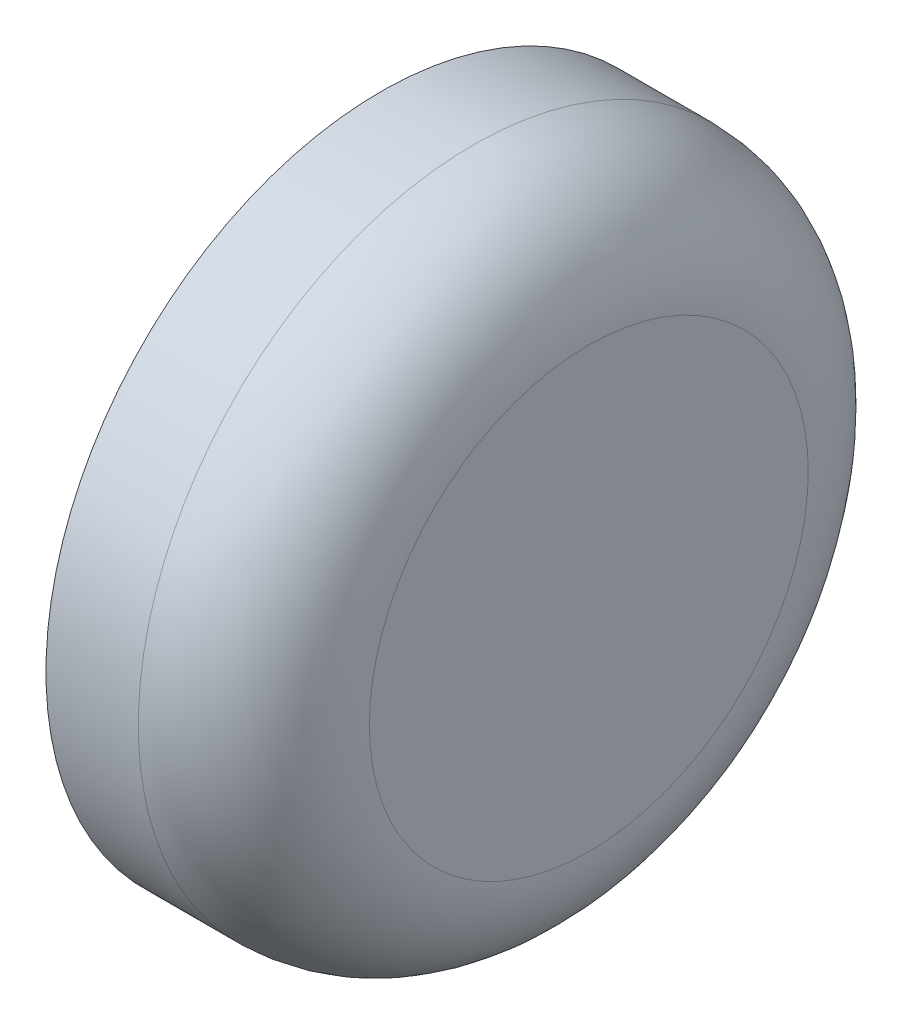
ISO-10303-21;
HEADER;
FILE_DESCRIPTION(('STEP AP214'),'2;1');
FILE_NAME('part.step','',(''),(''),'','','');
FILE_SCHEMA(('AUTOMOTIVE_DESIGN { 1 0 10303 214 1 1 1 1 }'));
ENDSEC;
DATA;
#1=APPLICATION_CONTEXT('core data for automotive mechanical design processes');
#2=APPLICATION_PROTOCOL_DEFINITION('international standard','automotive_design',2000,#1);
#3=PRODUCT_CONTEXT('',#1,'mechanical');
#4=PRODUCT('Part','Part','',(#3));
#5=PRODUCT_RELATED_PRODUCT_CATEGORY('part','',(#4));
#6=PRODUCT_DEFINITION_FORMATION('','',#4);
#7=PRODUCT_DEFINITION_CONTEXT('part definition',#1,'design');
#8=PRODUCT_DEFINITION('design','',#6,#7);
#9=PRODUCT_DEFINITION_SHAPE('','',#8);
#10=(LENGTH_UNIT() NAMED_UNIT(*) SI_UNIT(.MILLI.,.METRE.));
#11=(NAMED_UNIT(*) PLANE_ANGLE_UNIT() SI_UNIT($,.RADIAN.));
#12=(NAMED_UNIT(*) SI_UNIT($,.STERADIAN.) SOLID_ANGLE_UNIT());
#13=UNCERTAINTY_MEASURE_WITH_UNIT(LENGTH_MEASURE(1.E-05),#10,'distance_accuracy_value','');
#14=(GEOMETRIC_REPRESENTATION_CONTEXT(3) GLOBAL_UNCERTAINTY_ASSIGNED_CONTEXT((#13)) GLOBAL_UNIT_ASSIGNED_CONTEXT((#10,
#11,#12)) REPRESENTATION_CONTEXT('',''));
#15=CARTESIAN_POINT('',(0.,0.,0.));
#16=DIRECTION('',(0.,0.,1.));
#17=DIRECTION('',(1.,0.,0.));
#18=AXIS2_PLACEMENT_3D('',#15,#16,#17);
#19=CARTESIAN_POINT('',(4.5,0.,0.));
#20=DIRECTION('',(-1.,0.,0.));
#21=DIRECTION('',(0.,0.,1.));
#22=AXIS2_PLACEMENT_3D('',#19,#20,#21);
#23=CYLINDRICAL_SURFACE('',#22,7.25);
#24=CARTESIAN_POINT('',(2.,0.,0.));
#25=DIRECTION('',(1.,0.,0.));
#26=DIRECTION('',(0.,0.,-1.));
#27=AXIS2_PLACEMENT_3D('',#24,#25,#26);
#28=CIRCLE('',#27,7.25);
#29=CARTESIAN_POINT('',(2.,0.,-7.25));
#30=VERTEX_POINT('',#29);
#31=EDGE_CURVE('E10',#30,#30,#28,.F.);
#32=ORIENTED_EDGE('',*,*,#31,.T.);
#33=EDGE_LOOP('',(#32));
#34=FACE_BOUND('',#33,.T.);
#35=CARTESIAN_POINT('',(0.,0.,0.));
#36=DIRECTION('',(1.,0.,0.));
#37=DIRECTION('',(0.,0.,-1.));
#38=AXIS2_PLACEMENT_3D('',#35,#36,#37);
#39=CIRCLE('',#38,7.25);
#40=CARTESIAN_POINT('',(0.,0.,-7.25));
#41=VERTEX_POINT('',#40);
#42=EDGE_CURVE('E50',#41,#41,#39,.T.);
#43=ORIENTED_EDGE('',*,*,#42,.T.);
#44=EDGE_LOOP('',(#43));
#45=FACE_BOUND('',#44,.T.);
#46=ADVANCED_FACE('F37',(#34,#45),#23,.T.);
#47=CARTESIAN_POINT('',(4.5,0.,0.));
#48=DIRECTION('',(1.,0.,0.));
#49=DIRECTION('',(0.,0.,-1.));
#50=AXIS2_PLACEMENT_3D('',#47,#48,#49);
#51=PLANE('',#50);
#52=CARTESIAN_POINT('',(4.5,0.,0.));
#53=DIRECTION('',(1.,0.,0.));
#54=DIRECTION('',(0.,0.,-1.));
#55=AXIS2_PLACEMENT_3D('',#52,#53,#54);
#56=CIRCLE('',#55,4.75);
#57=CARTESIAN_POINT('',(4.5,0.,-4.75));
#58=VERTEX_POINT('',#57);
#59=EDGE_CURVE('E45',#58,#58,#56,.T.);
#60=ORIENTED_EDGE('',*,*,#59,.T.);
#61=EDGE_LOOP('',(#60));
#62=FACE_BOUND('',#61,.T.);
#63=ADVANCED_FACE('F77',(#62),#51,.T.);
#64=CARTESIAN_POINT('',(0.,0.,0.));
#65=DIRECTION('',(1.,0.,0.));
#66=DIRECTION('',(0.,0.,-1.));
#67=AXIS2_PLACEMENT_3D('',#64,#65,#66);
#68=PLANE('',#67);
#69=CARTESIAN_POINT('',(0.,0.,0.));
#70=DIRECTION('',(-1.,0.,0.));
#71=DIRECTION('',(0.,0.,1.));
#72=AXIS2_PLACEMENT_3D('',#69,#70,#71);
#73=CIRCLE('',#72,3.3);
#74=CARTESIAN_POINT('',(0.,0.,3.3));
#75=VERTEX_POINT('',#74);
#76=EDGE_CURVE('E58',#75,#75,#73,.T.);
#77=ORIENTED_EDGE('',*,*,#76,.F.);
#78=EDGE_LOOP('',(#77));
#79=FACE_BOUND('',#78,.T.);
#80=ORIENTED_EDGE('',*,*,#42,.F.);
#81=EDGE_LOOP('',(#80));
#82=FACE_BOUND('',#81,.T.);
#83=ADVANCED_FACE('F74',(#79,#82),#68,.F.);
#84=CARTESIAN_POINT('',(2.,0.,0.));
#85=DIRECTION('',(1.,0.,0.));
#86=DIRECTION('',(0.,0.,-1.));
#87=AXIS2_PLACEMENT_3D('',#84,#85,#86);
#88=TOROIDAL_SURFACE('',#87,4.75,2.5);
#89=ORIENTED_EDGE('',*,*,#31,.F.);
#90=EDGE_LOOP('',(#89));
#91=FACE_BOUND('',#90,.T.);
#92=ORIENTED_EDGE('',*,*,#59,.F.);
#93=EDGE_LOOP('',(#92));
#94=FACE_BOUND('',#93,.T.);
#95=ADVANCED_FACE('F39',(#91,#94),#88,.T.);
#96=CARTESIAN_POINT('',(1.,0.,0.));
#97=DIRECTION('',(-1.,0.,0.));
#98=DIRECTION('',(0.,0.,1.));
#99=AXIS2_PLACEMENT_3D('',#96,#97,#98);
#100=CYLINDRICAL_SURFACE('',#99,3.3);
#101=CARTESIAN_POINT('',(1.,0.,0.));
#102=DIRECTION('',(-1.,0.,0.));
#103=DIRECTION('',(0.,0.,1.));
#104=AXIS2_PLACEMENT_3D('',#101,#102,#103);
#105=CIRCLE('',#104,3.3);
#106=CARTESIAN_POINT('',(1.,0.,3.3));
#107=VERTEX_POINT('',#106);
#108=EDGE_CURVE('E55',#107,#107,#105,.T.);
#109=ORIENTED_EDGE('',*,*,#108,.F.);
#110=EDGE_LOOP('',(#109));
#111=FACE_BOUND('',#110,.T.);
#112=ORIENTED_EDGE('',*,*,#76,.T.);
#113=EDGE_LOOP('',(#112));
#114=FACE_BOUND('',#113,.T.);
#115=ADVANCED_FACE('F68',(#111,#114),#100,.F.);
#116=CARTESIAN_POINT('',(1.,0.,0.));
#117=DIRECTION('',(-1.,0.,0.));
#118=DIRECTION('',(0.,0.,1.));
#119=AXIS2_PLACEMENT_3D('',#116,#117,#118);
#120=PLANE('',#119);
#121=ORIENTED_EDGE('',*,*,#108,.T.);
#122=EDGE_LOOP('',(#121));
#123=FACE_BOUND('',#122,.T.);
#124=ADVANCED_FACE('F66',(#123),#120,.T.);
#125=CLOSED_SHELL('',(#46,#63,#83,#95,#115,#124));
#126=MANIFOLD_SOLID_BREP('B2',#125);
#127=ADVANCED_BREP_SHAPE_REPRESENTATION('',(#18,#126),#14);
#128=SHAPE_DEFINITION_REPRESENTATION(#9,#127);
ENDSEC;
END-ISO-10303-21;
